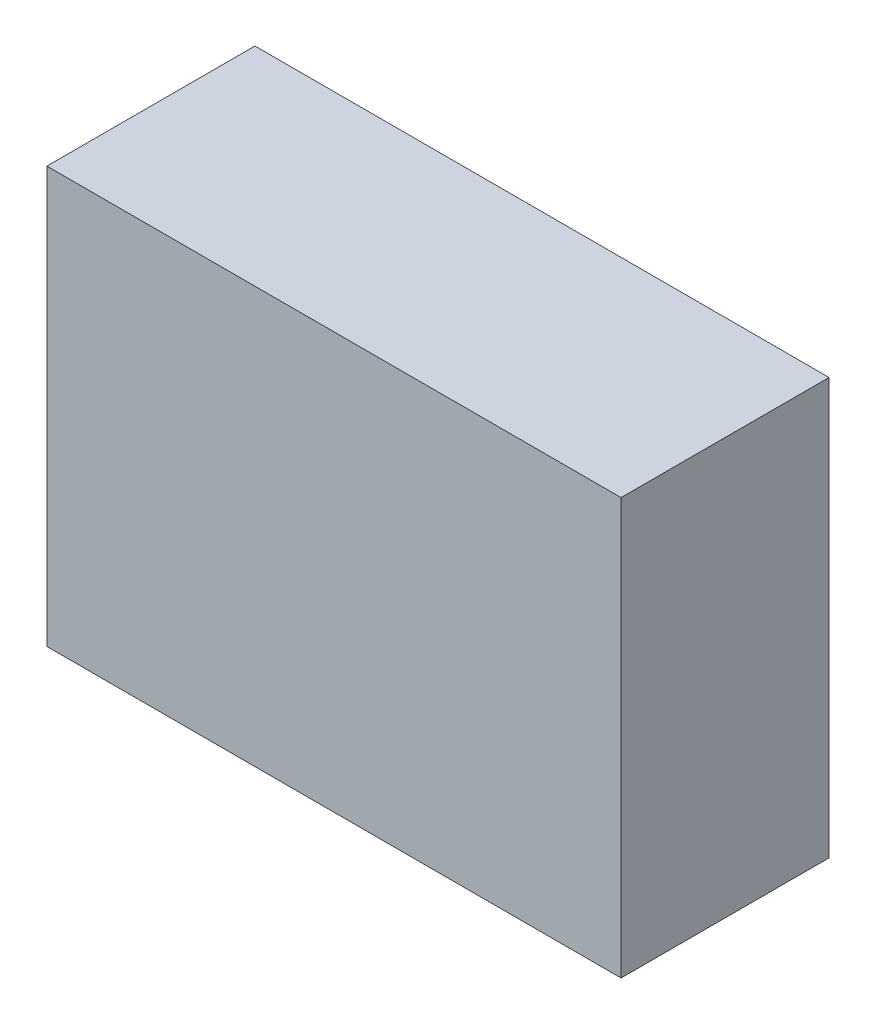
ISO-10303-21;
HEADER;
FILE_DESCRIPTION(('STEP AP214'),'2;1');
FILE_NAME('part.step','',(''),(''),'','','');
FILE_SCHEMA(('AUTOMOTIVE_DESIGN { 1 0 10303 214 1 1 1 1 }'));
ENDSEC;
DATA;
#1=APPLICATION_CONTEXT('core data for automotive mechanical design processes');
#2=APPLICATION_PROTOCOL_DEFINITION('international standard','automotive_design',2000,#1);
#3=PRODUCT_CONTEXT('',#1,'mechanical');
#4=PRODUCT('Part','Part','',(#3));
#5=PRODUCT_RELATED_PRODUCT_CATEGORY('part','',(#4));
#6=PRODUCT_DEFINITION_FORMATION('','',#4);
#7=PRODUCT_DEFINITION_CONTEXT('part definition',#1,'design');
#8=PRODUCT_DEFINITION('design','',#6,#7);
#9=PRODUCT_DEFINITION_SHAPE('','',#8);
#10=(LENGTH_UNIT() NAMED_UNIT(*) SI_UNIT(.MILLI.,.METRE.));
#11=(NAMED_UNIT(*) PLANE_ANGLE_UNIT() SI_UNIT($,.RADIAN.));
#12=(NAMED_UNIT(*) SI_UNIT($,.STERADIAN.) SOLID_ANGLE_UNIT());
#13=UNCERTAINTY_MEASURE_WITH_UNIT(LENGTH_MEASURE(1.E-05),#10,'distance_accuracy_value','');
#14=(GEOMETRIC_REPRESENTATION_CONTEXT(3) GLOBAL_UNCERTAINTY_ASSIGNED_CONTEXT((#13)) GLOBAL_UNIT_ASSIGNED_CONTEXT((#10,
#11,#12)) REPRESENTATION_CONTEXT('',''));
#15=CARTESIAN_POINT('',(0.,0.,0.));
#16=DIRECTION('',(0.,0.,1.));
#17=DIRECTION('',(1.,0.,0.));
#18=AXIS2_PLACEMENT_3D('',#15,#16,#17);
#19=CARTESIAN_POINT('',(-345.,-745.,125.));
#20=DIRECTION('',(1.,0.,0.));
#21=DIRECTION('',(0.,0.,-1.));
#22=AXIS2_PLACEMENT_3D('',#19,#20,#21);
#23=PLANE('',#22);
#24=DIRECTION('',(0.,-1.,0.));
#25=VECTOR('',#24,1.);
#26=CARTESIAN_POINT('',(-345.,-745.,-125.));
#27=LINE('',#26,#25);
#28=CARTESIAN_POINT('',(-345.,-245.,-125.));
#29=VERTEX_POINT('',#28);
#30=CARTESIAN_POINT('',(-345.,-745.,-125.));
#31=VERTEX_POINT('',#30);
#32=EDGE_CURVE('E97',#29,#31,#27,.T.);
#33=ORIENTED_EDGE('',*,*,#32,.T.);
#34=DIRECTION('',(0.,0.,-1.));
#35=VECTOR('',#34,1.);
#36=CARTESIAN_POINT('',(-345.,-745.,125.));
#37=LINE('',#36,#35);
#38=CARTESIAN_POINT('',(-345.,-745.,125.));
#39=VERTEX_POINT('',#38);
#40=EDGE_CURVE('E11',#39,#31,#37,.T.);
#41=ORIENTED_EDGE('',*,*,#40,.F.);
#42=DIRECTION('',(0.,-1.,0.));
#43=VECTOR('',#42,1.);
#44=CARTESIAN_POINT('',(-345.,-745.,125.));
#45=LINE('',#44,#43);
#46=CARTESIAN_POINT('',(-345.,-245.,125.));
#47=VERTEX_POINT('',#46);
#48=EDGE_CURVE('E85',#47,#39,#45,.T.);
#49=ORIENTED_EDGE('',*,*,#48,.F.);
#50=DIRECTION('',(0.,0.,-1.));
#51=VECTOR('',#50,1.);
#52=CARTESIAN_POINT('',(-345.,-245.,125.));
#53=LINE('',#52,#51);
#54=EDGE_CURVE('E93',#47,#29,#53,.T.);
#55=ORIENTED_EDGE('',*,*,#54,.T.);
#56=EDGE_LOOP('',(#33,#41,#49,#55));
#57=FACE_BOUND('',#56,.T.);
#58=ADVANCED_FACE('F34',(#57),#23,.F.);
#59=CARTESIAN_POINT('',(-345.,-745.,125.));
#60=DIRECTION('',(0.,1.,0.));
#61=DIRECTION('',(0.,0.,1.));
#62=AXIS2_PLACEMENT_3D('',#59,#60,#61);
#63=PLANE('',#62);
#64=DIRECTION('',(1.,0.,0.));
#65=VECTOR('',#64,1.);
#66=CARTESIAN_POINT('',(-345.,-745.,-125.));
#67=LINE('',#66,#65);
#68=CARTESIAN_POINT('',(345.,-745.,-125.));
#69=VERTEX_POINT('',#68);
#70=EDGE_CURVE('E89',#31,#69,#67,.T.);
#71=ORIENTED_EDGE('',*,*,#70,.T.);
#72=DIRECTION('',(0.,0.,-1.));
#73=VECTOR('',#72,1.);
#74=CARTESIAN_POINT('',(345.,-745.,125.));
#75=LINE('',#74,#73);
#76=CARTESIAN_POINT('',(345.,-745.,125.));
#77=VERTEX_POINT('',#76);
#78=EDGE_CURVE('E42',#77,#69,#75,.T.);
#79=ORIENTED_EDGE('',*,*,#78,.F.);
#80=DIRECTION('',(1.,0.,0.));
#81=VECTOR('',#80,1.);
#82=CARTESIAN_POINT('',(-345.,-745.,125.));
#83=LINE('',#82,#81);
#84=EDGE_CURVE('E80',#39,#77,#83,.T.);
#85=ORIENTED_EDGE('',*,*,#84,.F.);
#86=ORIENTED_EDGE('',*,*,#40,.T.);
#87=EDGE_LOOP('',(#71,#79,#85,#86));
#88=FACE_BOUND('',#87,.T.);
#89=ADVANCED_FACE('F88',(#88),#63,.F.);
#90=CARTESIAN_POINT('',(345.,-745.,125.));
#91=DIRECTION('',(-1.,0.,0.));
#92=DIRECTION('',(0.,-1.,0.));
#93=AXIS2_PLACEMENT_3D('',#90,#91,#92);
#94=PLANE('',#93);
#95=DIRECTION('',(0.,1.,0.));
#96=VECTOR('',#95,1.);
#97=CARTESIAN_POINT('',(345.,-745.,-125.));
#98=LINE('',#97,#96);
#99=CARTESIAN_POINT('',(345.,-245.,-125.));
#100=VERTEX_POINT('',#99);
#101=EDGE_CURVE('E67',#69,#100,#98,.T.);
#102=ORIENTED_EDGE('',*,*,#101,.T.);
#103=DIRECTION('',(0.,0.,-1.));
#104=VECTOR('',#103,1.);
#105=CARTESIAN_POINT('',(345.,-245.,125.));
#106=LINE('',#105,#104);
#107=CARTESIAN_POINT('',(345.,-245.,125.));
#108=VERTEX_POINT('',#107);
#109=EDGE_CURVE('E90',#108,#100,#106,.T.);
#110=ORIENTED_EDGE('',*,*,#109,.F.);
#111=DIRECTION('',(0.,1.,0.));
#112=VECTOR('',#111,1.);
#113=CARTESIAN_POINT('',(345.,-745.,125.));
#114=LINE('',#113,#112);
#115=EDGE_CURVE('E83',#77,#108,#114,.T.);
#116=ORIENTED_EDGE('',*,*,#115,.F.);
#117=ORIENTED_EDGE('',*,*,#78,.T.);
#118=EDGE_LOOP('',(#102,#110,#116,#117));
#119=FACE_BOUND('',#118,.T.);
#120=ADVANCED_FACE('F91',(#119),#94,.F.);
#121=CARTESIAN_POINT('',(-345.,-245.,125.));
#122=DIRECTION('',(0.,-1.,0.));
#123=DIRECTION('',(0.,0.,-1.));
#124=AXIS2_PLACEMENT_3D('',#121,#122,#123);
#125=PLANE('',#124);
#126=DIRECTION('',(-1.,0.,0.));
#127=VECTOR('',#126,1.);
#128=CARTESIAN_POINT('',(-345.,-245.,-125.));
#129=LINE('',#128,#127);
#130=EDGE_CURVE('E73',#100,#29,#129,.T.);
#131=ORIENTED_EDGE('',*,*,#130,.T.);
#132=ORIENTED_EDGE('',*,*,#54,.F.);
#133=DIRECTION('',(-1.,0.,0.));
#134=VECTOR('',#133,1.);
#135=CARTESIAN_POINT('',(-345.,-245.,125.));
#136=LINE('',#135,#134);
#137=EDGE_CURVE('E50',#108,#47,#136,.T.);
#138=ORIENTED_EDGE('',*,*,#137,.F.);
#139=ORIENTED_EDGE('',*,*,#109,.T.);
#140=EDGE_LOOP('',(#131,#132,#138,#139));
#141=FACE_BOUND('',#140,.T.);
#142=ADVANCED_FACE('F104',(#141),#125,.F.);
#143=CARTESIAN_POINT('',(0.,0.,125.));
#144=DIRECTION('',(0.,0.,-1.));
#145=DIRECTION('',(-1.,0.,0.));
#146=AXIS2_PLACEMENT_3D('',#143,#144,#145);
#147=PLANE('',#146);
#148=ORIENTED_EDGE('',*,*,#48,.T.);
#149=ORIENTED_EDGE('',*,*,#84,.T.);
#150=ORIENTED_EDGE('',*,*,#115,.T.);
#151=ORIENTED_EDGE('',*,*,#137,.T.);
#152=EDGE_LOOP('',(#148,#149,#150,#151));
#153=FACE_BOUND('',#152,.T.);
#154=ADVANCED_FACE('F81',(#153),#147,.F.);
#155=CARTESIAN_POINT('',(0.,0.,-125.));
#156=DIRECTION('',(0.,0.,-1.));
#157=DIRECTION('',(-1.,0.,0.));
#158=AXIS2_PLACEMENT_3D('',#155,#156,#157);
#159=PLANE('',#158);
#160=ORIENTED_EDGE('',*,*,#32,.F.);
#161=ORIENTED_EDGE('',*,*,#130,.F.);
#162=ORIENTED_EDGE('',*,*,#101,.F.);
#163=ORIENTED_EDGE('',*,*,#70,.F.);
#164=EDGE_LOOP('',(#160,#161,#162,#163));
#165=FACE_BOUND('',#164,.T.);
#166=ADVANCED_FACE('F107',(#165),#159,.T.);
#167=CLOSED_SHELL('',(#58,#89,#120,#142,#154,#166));
#168=MANIFOLD_SOLID_BREP('B2',#167);
#169=ADVANCED_BREP_SHAPE_REPRESENTATION('',(#18,#168),#14);
#170=SHAPE_DEFINITION_REPRESENTATION(#9,#169);
ENDSEC;
END-ISO-10303-21;
